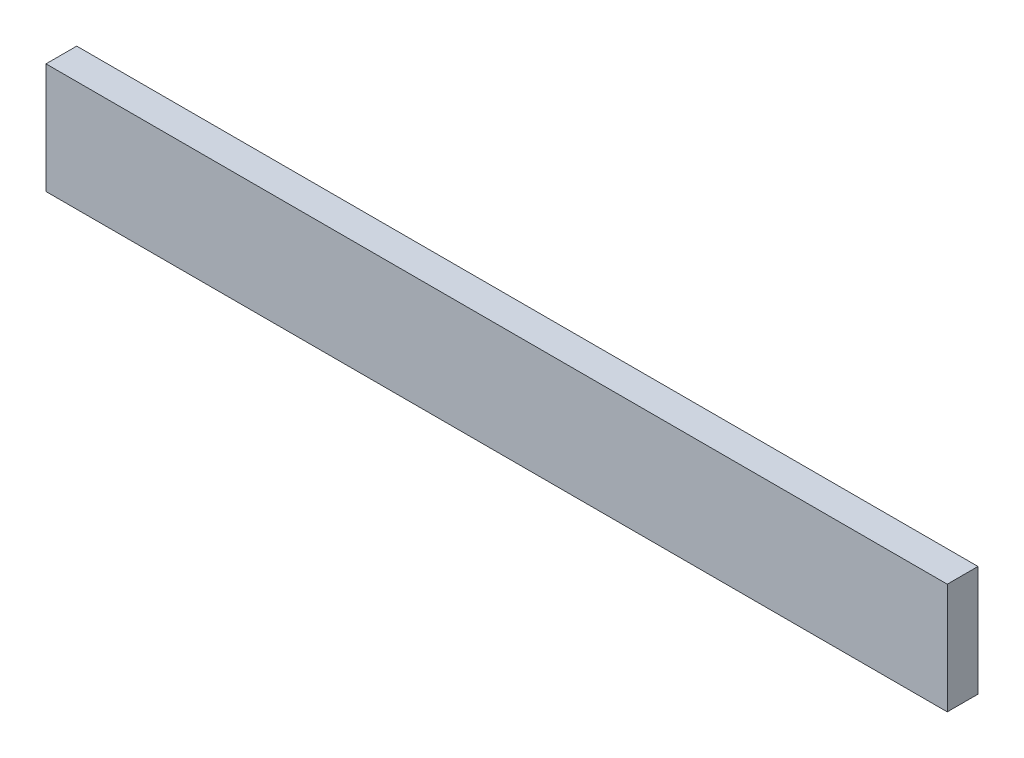
ISO-10303-21;
HEADER;
FILE_DESCRIPTION(('STEP AP214'),'2;1');
FILE_NAME('part.step','',(''),(''),'','','');
FILE_SCHEMA(('AUTOMOTIVE_DESIGN { 1 0 10303 214 1 1 1 1 }'));
ENDSEC;
DATA;
#1=APPLICATION_CONTEXT('core data for automotive mechanical design processes');
#2=APPLICATION_PROTOCOL_DEFINITION('international standard','automotive_design',2000,#1);
#3=PRODUCT_CONTEXT('',#1,'mechanical');
#4=PRODUCT('Part','Part','',(#3));
#5=PRODUCT_RELATED_PRODUCT_CATEGORY('part','',(#4));
#6=PRODUCT_DEFINITION_FORMATION('','',#4);
#7=PRODUCT_DEFINITION_CONTEXT('part definition',#1,'design');
#8=PRODUCT_DEFINITION('design','',#6,#7);
#9=PRODUCT_DEFINITION_SHAPE('','',#8);
#10=(LENGTH_UNIT() NAMED_UNIT(*) SI_UNIT(.MILLI.,.METRE.));
#11=(NAMED_UNIT(*) PLANE_ANGLE_UNIT() SI_UNIT($,.RADIAN.));
#12=(NAMED_UNIT(*) SI_UNIT($,.STERADIAN.) SOLID_ANGLE_UNIT());
#13=UNCERTAINTY_MEASURE_WITH_UNIT(LENGTH_MEASURE(1.E-05),#10,'distance_accuracy_value','');
#14=(GEOMETRIC_REPRESENTATION_CONTEXT(3) GLOBAL_UNCERTAINTY_ASSIGNED_CONTEXT((#13)) GLOBAL_UNIT_ASSIGNED_CONTEXT((#10,
#11,#12)) REPRESENTATION_CONTEXT('',''));
#15=CARTESIAN_POINT('',(0.,0.,0.));
#16=DIRECTION('',(0.,0.,1.));
#17=DIRECTION('',(1.,0.,0.));
#18=AXIS2_PLACEMENT_3D('',#15,#16,#17);
#19=CARTESIAN_POINT('',(0.,0.,15.));
#20=DIRECTION('',(1.,0.,0.));
#21=DIRECTION('',(0.,0.,-1.));
#22=AXIS2_PLACEMENT_3D('',#19,#20,#21);
#23=PLANE('',#22);
#24=DIRECTION('',(0.,-1.,0.));
#25=VECTOR('',#24,1.);
#26=CARTESIAN_POINT('',(0.,0.,0.));
#27=LINE('',#26,#25);
#28=CARTESIAN_POINT('',(0.,54.,0.));
#29=VERTEX_POINT('',#28);
#30=CARTESIAN_POINT('',(0.,0.,0.));
#31=VERTEX_POINT('',#30);
#32=EDGE_CURVE('E96',#29,#31,#27,.T.);
#33=ORIENTED_EDGE('',*,*,#32,.T.);
#34=DIRECTION('',(0.,0.,-1.));
#35=VECTOR('',#34,1.);
#36=CARTESIAN_POINT('',(0.,0.,15.));
#37=LINE('',#36,#35);
#38=CARTESIAN_POINT('',(0.,0.,15.));
#39=VERTEX_POINT('',#38);
#40=EDGE_CURVE('E11',#39,#31,#37,.T.);
#41=ORIENTED_EDGE('',*,*,#40,.F.);
#42=DIRECTION('',(0.,-1.,0.));
#43=VECTOR('',#42,1.);
#44=CARTESIAN_POINT('',(0.,0.,15.));
#45=LINE('',#44,#43);
#46=CARTESIAN_POINT('',(0.,54.,15.));
#47=VERTEX_POINT('',#46);
#48=EDGE_CURVE('E84',#47,#39,#45,.T.);
#49=ORIENTED_EDGE('',*,*,#48,.F.);
#50=DIRECTION('',(0.,0.,-1.));
#51=VECTOR('',#50,1.);
#52=CARTESIAN_POINT('',(0.,54.,15.));
#53=LINE('',#52,#51);
#54=EDGE_CURVE('E92',#47,#29,#53,.T.);
#55=ORIENTED_EDGE('',*,*,#54,.T.);
#56=EDGE_LOOP('',(#33,#41,#49,#55));
#57=FACE_BOUND('',#56,.T.);
#58=ADVANCED_FACE('F33',(#57),#23,.F.);
#59=CARTESIAN_POINT('',(0.,0.,15.));
#60=DIRECTION('',(0.,1.,0.));
#61=DIRECTION('',(0.,0.,1.));
#62=AXIS2_PLACEMENT_3D('',#59,#60,#61);
#63=PLANE('',#62);
#64=DIRECTION('',(1.,0.,0.));
#65=VECTOR('',#64,1.);
#66=CARTESIAN_POINT('',(0.,0.,0.));
#67=LINE('',#66,#65);
#68=CARTESIAN_POINT('',(440.,0.,0.));
#69=VERTEX_POINT('',#68);
#70=EDGE_CURVE('E88',#31,#69,#67,.T.);
#71=ORIENTED_EDGE('',*,*,#70,.T.);
#72=DIRECTION('',(0.,0.,-1.));
#73=VECTOR('',#72,1.);
#74=CARTESIAN_POINT('',(440.,0.,15.));
#75=LINE('',#74,#73);
#76=CARTESIAN_POINT('',(440.,0.,15.));
#77=VERTEX_POINT('',#76);
#78=EDGE_CURVE('E41',#77,#69,#75,.T.);
#79=ORIENTED_EDGE('',*,*,#78,.F.);
#80=DIRECTION('',(1.,0.,0.));
#81=VECTOR('',#80,1.);
#82=CARTESIAN_POINT('',(0.,0.,15.));
#83=LINE('',#82,#81);
#84=EDGE_CURVE('E79',#39,#77,#83,.T.);
#85=ORIENTED_EDGE('',*,*,#84,.F.);
#86=ORIENTED_EDGE('',*,*,#40,.T.);
#87=EDGE_LOOP('',(#71,#79,#85,#86));
#88=FACE_BOUND('',#87,.T.);
#89=ADVANCED_FACE('F87',(#88),#63,.F.);
#90=CARTESIAN_POINT('',(440.,0.,15.));
#91=DIRECTION('',(-1.,0.,0.));
#92=DIRECTION('',(0.,0.,1.));
#93=AXIS2_PLACEMENT_3D('',#90,#91,#92);
#94=PLANE('',#93);
#95=DIRECTION('',(0.,1.,0.));
#96=VECTOR('',#95,1.);
#97=CARTESIAN_POINT('',(440.,0.,0.));
#98=LINE('',#97,#96);
#99=CARTESIAN_POINT('',(440.,54.,0.));
#100=VERTEX_POINT('',#99);
#101=EDGE_CURVE('E66',#69,#100,#98,.T.);
#102=ORIENTED_EDGE('',*,*,#101,.T.);
#103=DIRECTION('',(0.,0.,-1.));
#104=VECTOR('',#103,1.);
#105=CARTESIAN_POINT('',(440.,54.,15.));
#106=LINE('',#105,#104);
#107=CARTESIAN_POINT('',(440.,54.,15.));
#108=VERTEX_POINT('',#107);
#109=EDGE_CURVE('E89',#108,#100,#106,.T.);
#110=ORIENTED_EDGE('',*,*,#109,.F.);
#111=DIRECTION('',(0.,1.,0.));
#112=VECTOR('',#111,1.);
#113=CARTESIAN_POINT('',(440.,0.,15.));
#114=LINE('',#113,#112);
#115=EDGE_CURVE('E82',#77,#108,#114,.T.);
#116=ORIENTED_EDGE('',*,*,#115,.F.);
#117=ORIENTED_EDGE('',*,*,#78,.T.);
#118=EDGE_LOOP('',(#102,#110,#116,#117));
#119=FACE_BOUND('',#118,.T.);
#120=ADVANCED_FACE('F90',(#119),#94,.F.);
#121=CARTESIAN_POINT('',(0.,54.,15.));
#122=DIRECTION('',(0.,-1.,0.));
#123=DIRECTION('',(0.,0.,-1.));
#124=AXIS2_PLACEMENT_3D('',#121,#122,#123);
#125=PLANE('',#124);
#126=DIRECTION('',(-1.,0.,0.));
#127=VECTOR('',#126,1.);
#128=CARTESIAN_POINT('',(0.,54.,0.));
#129=LINE('',#128,#127);
#130=EDGE_CURVE('E72',#100,#29,#129,.T.);
#131=ORIENTED_EDGE('',*,*,#130,.T.);
#132=ORIENTED_EDGE('',*,*,#54,.F.);
#133=DIRECTION('',(-1.,0.,0.));
#134=VECTOR('',#133,1.);
#135=CARTESIAN_POINT('',(0.,54.,15.));
#136=LINE('',#135,#134);
#137=EDGE_CURVE('E49',#108,#47,#136,.T.);
#138=ORIENTED_EDGE('',*,*,#137,.F.);
#139=ORIENTED_EDGE('',*,*,#109,.T.);
#140=EDGE_LOOP('',(#131,#132,#138,#139));
#141=FACE_BOUND('',#140,.T.);
#142=ADVANCED_FACE('F103',(#141),#125,.F.);
#143=CARTESIAN_POINT('',(0.,0.,15.));
#144=DIRECTION('',(0.,0.,-1.));
#145=DIRECTION('',(-1.,0.,0.));
#146=AXIS2_PLACEMENT_3D('',#143,#144,#145);
#147=PLANE('',#146);
#148=ORIENTED_EDGE('',*,*,#48,.T.);
#149=ORIENTED_EDGE('',*,*,#84,.T.);
#150=ORIENTED_EDGE('',*,*,#115,.T.);
#151=ORIENTED_EDGE('',*,*,#137,.T.);
#152=EDGE_LOOP('',(#148,#149,#150,#151));
#153=FACE_BOUND('',#152,.T.);
#154=ADVANCED_FACE('F80',(#153),#147,.F.);
#155=CARTESIAN_POINT('',(0.,0.,0.));
#156=DIRECTION('',(0.,0.,-1.));
#157=DIRECTION('',(-1.,0.,0.));
#158=AXIS2_PLACEMENT_3D('',#155,#156,#157);
#159=PLANE('',#158);
#160=ORIENTED_EDGE('',*,*,#32,.F.);
#161=ORIENTED_EDGE('',*,*,#130,.F.);
#162=ORIENTED_EDGE('',*,*,#101,.F.);
#163=ORIENTED_EDGE('',*,*,#70,.F.);
#164=EDGE_LOOP('',(#160,#161,#162,#163));
#165=FACE_BOUND('',#164,.T.);
#166=ADVANCED_FACE('F106',(#165),#159,.T.);
#167=CLOSED_SHELL('',(#58,#89,#120,#142,#154,#166));
#168=MANIFOLD_SOLID_BREP('B2',#167);
#169=ADVANCED_BREP_SHAPE_REPRESENTATION('',(#18,#168),#14);
#170=SHAPE_DEFINITION_REPRESENTATION(#9,#169);
ENDSEC;
END-ISO-10303-21;
